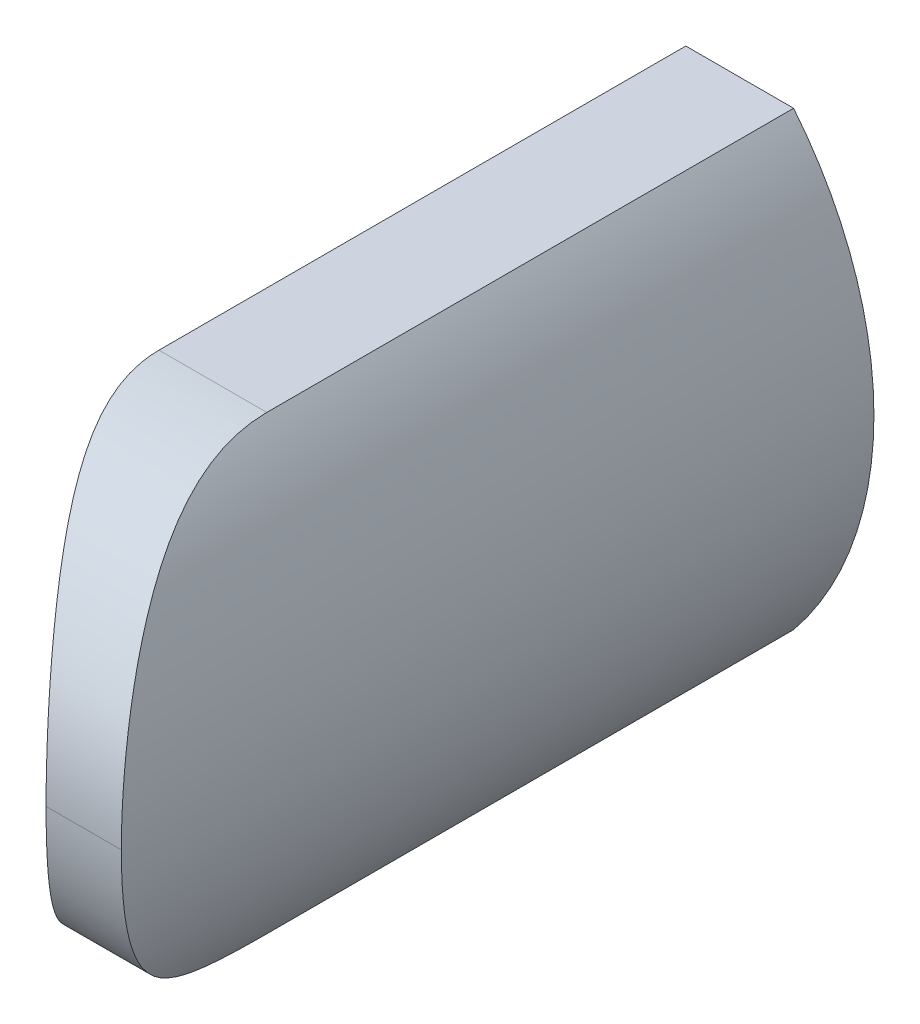
ISO-10303-21;
HEADER;
FILE_DESCRIPTION(('STEP AP214'),'2;1');
FILE_NAME('part.step','',(''),(''),'','','');
FILE_SCHEMA(('AUTOMOTIVE_DESIGN { 1 0 10303 214 1 1 1 1 }'));
ENDSEC;
DATA;
#1=APPLICATION_CONTEXT('core data for automotive mechanical design processes');
#2=APPLICATION_PROTOCOL_DEFINITION('international standard','automotive_design',2000,#1);
#3=PRODUCT_CONTEXT('',#1,'mechanical');
#4=PRODUCT('Part','Part','',(#3));
#5=PRODUCT_RELATED_PRODUCT_CATEGORY('part','',(#4));
#6=PRODUCT_DEFINITION_FORMATION('','',#4);
#7=PRODUCT_DEFINITION_CONTEXT('part definition',#1,'design');
#8=PRODUCT_DEFINITION('design','',#6,#7);
#9=PRODUCT_DEFINITION_SHAPE('','',#8);
#10=(LENGTH_UNIT() NAMED_UNIT(*) SI_UNIT(.MILLI.,.METRE.));
#11=(NAMED_UNIT(*) PLANE_ANGLE_UNIT() SI_UNIT($,.RADIAN.));
#12=(NAMED_UNIT(*) SI_UNIT($,.STERADIAN.) SOLID_ANGLE_UNIT());
#13=UNCERTAINTY_MEASURE_WITH_UNIT(LENGTH_MEASURE(1.E-05),#10,'distance_accuracy_value','');
#14=(GEOMETRIC_REPRESENTATION_CONTEXT(3) GLOBAL_UNCERTAINTY_ASSIGNED_CONTEXT((#13)) GLOBAL_UNIT_ASSIGNED_CONTEXT((#10,
#11,#12)) REPRESENTATION_CONTEXT('',''));
#15=CARTESIAN_POINT('',(0.,0.,0.));
#16=DIRECTION('',(0.,0.,1.));
#17=DIRECTION('',(1.,0.,0.));
#18=AXIS2_PLACEMENT_3D('',#15,#16,#17);
#19=CARTESIAN_POINT('',(0.,0.,100.));
#20=DIRECTION('',(0.,0.,-1.));
#21=DIRECTION('',(-1.,0.,0.));
#22=AXIS2_PLACEMENT_3D('',#19,#20,#21);
#23=CYLINDRICAL_SURFACE('',#22,37.5);
#24=CARTESIAN_POINT('',(22.5,-30.,70.));
#25=CARTESIAN_POINT('',(22.4999755658131,-30.0000088825759,70.2845192925939));
#26=CARTESIAN_POINT('',(22.5053961319682,-29.9959526730682,70.569029306874));
#27=CARTESIAN_POINT('',(22.5269459636406,-29.9797771303198,71.1373805460761));
#28=CARTESIAN_POINT('',(22.5430739326886,-29.9676587732563,71.4212218477919));
#29=CARTESIAN_POINT('',(22.5858217303771,-29.9354528016734,71.9871830245057));
#30=CARTESIAN_POINT('',(22.6124240440559,-29.9153784905536,72.2693049789032));
#31=CARTESIAN_POINT('',(22.6757694694017,-29.867391002862,72.8317215549527));
#32=CARTESIAN_POINT('',(22.7125128202786,-29.8394776413798,73.1120161333403));
#33=CARTESIAN_POINT('',(22.836214295342,-29.7450522223366,73.9419379410892));
#34=CARTESIAN_POINT('',(22.9372477378027,-29.6674082944875,74.488293183895));
#35=CARTESIAN_POINT('',(23.1729159717614,-29.4836931538108,75.5689031377295));
#36=CARTESIAN_POINT('',(23.3075673844913,-29.37760787723,76.103151720098));
#37=CARTESIAN_POINT('',(23.6587511995601,-29.0960572585306,77.3455500224995));
#38=CARTESIAN_POINT('',(23.8873580231885,-28.9093418710917,78.0477527341277));
#39=CARTESIAN_POINT('',(24.3852596002021,-28.4906092412228,79.4235269183799));
#40=CARTESIAN_POINT('',(24.6545685474847,-28.2585761870519,80.0970882976126));
#41=CARTESIAN_POINT('',(25.2249605266702,-27.7506425687184,81.4195898362314));
#42=CARTESIAN_POINT('',(25.5262509126886,-27.4744490108981,82.0683269099209));
#43=CARTESIAN_POINT('',(26.1497085231763,-26.8817393803553,83.3364912075327));
#44=CARTESIAN_POINT('',(26.4718757265193,-26.5652233484368,83.9559184611141));
#45=CARTESIAN_POINT('',(27.247486489959,-25.772701393832,85.3835368602757));
#46=CARTESIAN_POINT('',(27.7065148674869,-25.2802465216955,86.1796051370515));
#47=CARTESIAN_POINT('',(28.6330096703475,-24.2258942617638,87.7193922631023));
#48=CARTESIAN_POINT('',(29.1004790204633,-23.6639723935857,88.4630925119771));
#49=CARTESIAN_POINT('',(30.0297531085641,-22.4729504547567,89.8955356394915));
#50=CARTESIAN_POINT('',(30.4915668233143,-21.8439783021729,90.5843789361532));
#51=CARTESIAN_POINT('',(31.3986679639379,-20.5187274436987,91.9056335628192));
#52=CARTESIAN_POINT('',(31.8439608779519,-19.8224713713796,92.538063732862));
#53=CARTESIAN_POINT('',(32.6219663517772,-18.5073092423568,93.6232055259131));
#54=CARTESIAN_POINT('',(32.9595641522272,-17.9002229213543,94.0867647699818));
#55=CARTESIAN_POINT('',(33.6114585634017,-16.6439362752505,94.971374874733));
#56=CARTESIAN_POINT('',(33.9257560230783,-15.9947374861423,95.3924272843621));
#57=CARTESIAN_POINT('',(34.5251454181686,-14.6561041458242,96.1878587579433));
#58=CARTESIAN_POINT('',(34.8102612528835,-13.9667032578519,96.5622760707384));
#59=CARTESIAN_POINT('',(35.2118372251927,-12.9042624583826,97.0857147761584));
#60=CARTESIAN_POINT('',(35.3413415338409,-12.5454073954116,97.2538237624826));
#61=CARTESIAN_POINT('',(35.591025736255,-11.8184854269959,97.5768312267093));
#62=CARTESIAN_POINT('',(35.7112031641916,-11.4504161192868,97.7317262121773));
#63=CARTESIAN_POINT('',(36.0194760457166,-10.4534458225102,98.127868657706));
#64=CARTESIAN_POINT('',(36.1984702003831,-9.81666113328899,98.3565825753767));
#65=CARTESIAN_POINT('',(36.524990434802,-8.52177591365152,98.7722343802658));
#66=CARTESIAN_POINT('',(36.6725222547974,-7.86367929683643,98.9591798883479));
#67=CARTESIAN_POINT('',(36.8680297479422,-6.86393586274038,99.2062341995429));
#68=CARTESIAN_POINT('',(36.928869148048,-6.52881167904529,99.2829856467996));
#69=CARTESIAN_POINT('',(37.0417126561126,-5.8547672683848,99.4251651710082));
#70=CARTESIAN_POINT('',(37.0937183274969,-5.51584772447768,99.4905952516953));
#71=CARTESIAN_POINT('',(37.2360370778777,-4.49439557144583,99.6694750246301));
#72=CARTESIAN_POINT('',(37.3127330825291,-3.80675655641127,99.7656166128647));
#73=CARTESIAN_POINT('',(37.4134325060269,-2.59878792630196,99.8917378451276));
#74=CARTESIAN_POINT('',(37.4458627984957,-2.08020786856293,99.9323086950195));
#75=CARTESIAN_POINT('',(37.4891579436241,-1.04111645987851,99.9864474160654));
#76=CARTESIAN_POINT('',(37.500038099753,-0.520606742603307,100.000034449344));
#77=CARTESIAN_POINT('',(37.5,0.,100.));
#78=B_SPLINE_CURVE_WITH_KNOTS('',3,(#24,#25,#26,#27,#28,#29,#30,#31,#32,#33,#34,#35,#36,#37,#38,
#39,#40,#41,#42,#43,#44,#45,#46,#47,#48,#49,#50,#51,#52,#53,#54,#55,#56,#57,#58,#59,#60,#61,#62,
#63,#64,#65,#66,#67,#68,#69,#70,#71,#72,#73,#74,#75,#76,#77),.UNSPECIFIED.,.F.,.F.,(4,2,2,2,2,2,
2,2,2,2,2,2,2,2,2,2,2,2,2,2,2,2,2,2,2,2,4),(0.,0.853461655319061,1.70681999099969,
2.55875737945188,3.41071486538377,5.09153333129547,6.77318447062759,9.05470073284135,
11.3370144632647,13.6351522173132,15.9332876457926,19.0569624711207,22.1817412438871,
25.3006618037278,28.4185368210903,30.9216101329335,33.4245921999715,35.9255076784663,
37.1758640936124,38.4265499582637,40.52396337101,42.6209937866855,43.6681396143195,
44.7150999207258,46.8077255516257,48.3701793606076,49.9315232207576),.UNSPECIFIED.);
#79=CARTESIAN_POINT('',(22.5,-30.,70.));
#80=VERTEX_POINT('',#79);
#81=CARTESIAN_POINT('',(37.5,0.,100.));
#82=VERTEX_POINT('',#81);
#83=EDGE_CURVE('E59',#80,#82,#78,.T.);
#84=ORIENTED_EDGE('',*,*,#83,.T.);
#85=CARTESIAN_POINT('',(37.5,0.,100.));
#86=CARTESIAN_POINT('',(37.500010819369,0.362218520270511,100.000010261942));
#87=CARTESIAN_POINT('',(37.4947521408685,0.724430458356433,99.9934400902846));
#88=CARTESIAN_POINT('',(37.4737764392653,1.4480617852135,99.9672159890632));
#89=CARTESIAN_POINT('',(37.4580598723983,1.80948120786884,99.9475626302665));
#90=CARTESIAN_POINT('',(37.4162630161217,2.53053860988229,99.895266748233));
#91=CARTESIAN_POINT('',(37.3901896662152,2.89017761916106,99.8626329224636));
#92=CARTESIAN_POINT('',(37.3278456593031,3.60714468278668,99.784536355762));
#93=CARTESIAN_POINT('',(37.2915749498681,3.96447272524213,99.7390735488701));
#94=CARTESIAN_POINT('',(37.1683759923795,5.02661332053406,99.5844911820218));
#95=CARTESIAN_POINT('',(37.0667323223879,5.7271551775504,99.4567682894882));
#96=CARTESIAN_POINT('',(36.8262688650286,7.11123941215054,99.153603015151));
#97=CARTESIAN_POINT('',(36.6874445032417,7.79477968667706,98.9781547615535));
#98=CARTESIAN_POINT('',(36.3758832319662,9.13891877015147,98.582681401889));
#99=CARTESIAN_POINT('',(36.2032320862585,9.79957072537111,98.3627689852354));
#100=CARTESIAN_POINT('',(35.8270754734532,11.0962372955456,97.881032514544));
#101=CARTESIAN_POINT('',(35.6235709351086,11.7322526513915,97.6192097220849));
#102=CARTESIAN_POINT('',(35.1888437852252,12.9781079832019,97.0561785129403));
#103=CARTESIAN_POINT('',(34.9575759549589,13.5879029985659,96.7549057687392));
#104=CARTESIAN_POINT('',(34.4712072825657,14.7783455761204,96.116220016857));
#105=CARTESIAN_POINT('',(34.2161034952084,15.3589895226691,95.7788025422863));
#106=CARTESIAN_POINT('',(33.5935694168409,16.6862149590196,94.9475071697509));
#107=CARTESIAN_POINT('',(33.2178896335632,17.4204216945797,94.4399788298282));
#108=CARTESIAN_POINT('',(32.438637129187,18.8317574634167,93.369847635123));
#109=CARTESIAN_POINT('',(32.0350555270443,19.5088681696038,92.8072272207943));
#110=CARTESIAN_POINT('',(31.2078713705118,20.806540800048,91.6300072151435));
#111=CARTESIAN_POINT('',(30.784222716464,21.4269618694676,91.0152850950961));
#112=CARTESIAN_POINT('',(29.9269651172235,22.6088380197446,89.738221847327));
#113=CARTESIAN_POINT('',(29.4933573215228,23.170299864454,89.075886196588));
#114=CARTESIAN_POINT('',(28.619152522704,24.2421068745298,87.694535026837));
#115=CARTESIAN_POINT('',(28.1785523314988,24.7515146253686,86.9747947286401));
#116=CARTESIAN_POINT('',(27.3086453898674,25.7080819719638,85.4879394653739));
#117=CARTESIAN_POINT('',(26.8793422866718,26.1552216598723,84.7208094618908));
#118=CARTESIAN_POINT('',(26.2554074205718,26.7766641898664,83.5354504700038));
#119=CARTESIAN_POINT('',(26.0509895984756,26.9753999944134,83.1350342523555));
#120=CARTESIAN_POINT('',(25.6507564463487,27.356261639706,82.3221954493724));
#121=CARTESIAN_POINT('',(25.4549415351427,27.5383866722349,81.9097722811119));
#122=CARTESIAN_POINT('',(24.8841540097768,28.058742208421,80.6548815409657));
#123=CARTESIAN_POINT('',(24.5253484696591,28.3714333539267,79.7938822576464));
#124=CARTESIAN_POINT('',(24.0073717870351,28.8090255588542,78.3868520378598));
#125=CARTESIAN_POINT('',(23.8266160323057,28.9583932267527,77.8562123247088));
#126=CARTESIAN_POINT('',(23.4934543010885,29.2293283616286,76.7789869002862));
#127=CARTESIAN_POINT('',(23.3410481203536,29.350896028895,76.2324013039308));
#128=CARTESIAN_POINT('',(23.0705715818094,29.5639709924464,75.127107843029));
#129=CARTESIAN_POINT('',(22.952381001627,29.6555836912868,74.5684500216583));
#130=CARTESIAN_POINT('',(22.7547334345133,29.8075115005525,73.4403145910329));
#131=CARTESIAN_POINT('',(22.6752526247146,29.8678458618509,72.8708438610864));
#132=CARTESIAN_POINT('',(22.5783623846566,29.9411075608744,71.9172805673983));
#133=CARTESIAN_POINT('',(22.5490763715645,29.9631471319107,71.5350488302949));
#134=CARTESIAN_POINT('',(22.5098479600887,29.9926143679571,70.768570938288));
#135=CARTESIAN_POINT('',(22.4999291265209,30.0000242325447,70.3843228990598));
#136=CARTESIAN_POINT('',(22.5,30.,70.));
#137=B_SPLINE_CURVE_WITH_KNOTS('',3,(#85,#86,#87,#88,#89,#90,#91,#92,#93,#94,#95,#96,#97,#98,
#99,#100,#101,#102,#103,#104,#105,#106,#107,#108,#109,#110,#111,#112,#113,#114,#115,#116,#117,
#118,#119,#120,#121,#122,#123,#124,#125,#126,#127,#128,#129,#130,#131,#132,#133,#134,#135,#136),
.UNSPECIFIED.,.F.,.F.,(4,2,2,2,2,2,2,2,2,2,2,2,2,2,2,2,2,2,2,2,2,2,2,2,2,4),(0.,
1.08654608708858,2.17304477564666,3.25881668671824,4.34459418034611,6.49941862809946,
8.65450831034947,10.8042031219805,12.953833236046,15.1070132558852,17.2604596807505,
20.1615182191199,23.0635044430002,25.9725154794955,28.8811924263651,31.8353869431814,
34.7905237936848,36.2647022580913,37.7389524121646,40.6840446346466,42.4232002732122,
44.1623433813931,45.8952994091938,47.6271875847921,48.7784198558804,49.9310520062332),.UNSPECIFIED.);
#138=CARTESIAN_POINT('',(22.5,30.,70.));
#139=VERTEX_POINT('',#138);
#140=EDGE_CURVE('E52',#82,#139,#137,.T.);
#141=ORIENTED_EDGE('',*,*,#140,.T.);
#142=DIRECTION('',(0.,0.,-1.));
#143=VECTOR('',#142,1.);
#144=CARTESIAN_POINT('',(22.5,30.,100.));
#145=LINE('',#144,#143);
#146=CARTESIAN_POINT('',(22.5,30.,0.));
#147=VERTEX_POINT('',#146);
#148=EDGE_CURVE('E109',#139,#147,#145,.T.);
#149=ORIENTED_EDGE('',*,*,#148,.T.);
#150=CARTESIAN_POINT('',(0.,0.,0.));
#151=DIRECTION('',(0.,0.,1.));
#152=DIRECTION('',(1.,0.,0.));
#153=AXIS2_PLACEMENT_3D('',#150,#151,#152);
#154=CIRCLE('',#153,37.5);
#155=CARTESIAN_POINT('',(22.5,-30.,0.));
#156=VERTEX_POINT('',#155);
#157=EDGE_CURVE('E102',#156,#147,#154,.T.);
#158=ORIENTED_EDGE('',*,*,#157,.F.);
#159=DIRECTION('',(0.,0.,-1.));
#160=VECTOR('',#159,1.);
#161=CARTESIAN_POINT('',(22.5,-30.,100.));
#162=LINE('',#161,#160);
#163=EDGE_CURVE('E88',#80,#156,#162,.T.);
#164=ORIENTED_EDGE('',*,*,#163,.F.);
#165=EDGE_LOOP('',(#84,#141,#149,#158,#164));
#166=FACE_BOUND('',#165,.T.);
#167=ADVANCED_FACE('F41',(#166),#23,.F.);
#168=CARTESIAN_POINT('',(0.,-30.,100.));
#169=DIRECTION('',(0.,1.,0.));
#170=DIRECTION('',(0.,0.,1.));
#171=AXIS2_PLACEMENT_3D('',#168,#169,#170);
#172=PLANE('',#171);
#173=DIRECTION('',(0.,0.,-1.));
#174=VECTOR('',#173,1.);
#175=CARTESIAN_POINT('',(36.8272996566406,-30.,100.));
#176=LINE('',#175,#174);
#177=CARTESIAN_POINT('',(36.8272996566406,-30.,70.));
#178=VERTEX_POINT('',#177);
#179=CARTESIAN_POINT('',(36.8272996566406,-30.,0.));
#180=VERTEX_POINT('',#179);
#181=EDGE_CURVE('E96',#178,#180,#176,.T.);
#182=ORIENTED_EDGE('',*,*,#181,.F.);
#183=DIRECTION('',(1.,0.,0.));
#184=VECTOR('',#183,1.);
#185=CARTESIAN_POINT('',(22.5,-30.,70.));
#186=LINE('',#185,#184);
#187=EDGE_CURVE('E11',#178,#80,#186,.F.);
#188=ORIENTED_EDGE('',*,*,#187,.T.);
#189=ORIENTED_EDGE('',*,*,#163,.T.);
#190=DIRECTION('',(1.,0.,0.));
#191=VECTOR('',#190,1.);
#192=CARTESIAN_POINT('',(0.,-30.,0.));
#193=LINE('',#192,#191);
#194=EDGE_CURVE('E91',#156,#180,#193,.T.);
#195=ORIENTED_EDGE('',*,*,#194,.T.);
#196=EDGE_LOOP('',(#182,#188,#189,#195));
#197=FACE_BOUND('',#196,.T.);
#198=ADVANCED_FACE('F90',(#197),#172,.F.);
#199=CARTESIAN_POINT('',(0.,0.,100.));
#200=DIRECTION('',(0.,0.,-1.));
#201=DIRECTION('',(-1.,0.,0.));
#202=AXIS2_PLACEMENT_3D('',#199,#200,#201);
#203=CYLINDRICAL_SURFACE('',#202,47.5);
#204=DIRECTION('',(0.,0.,-1.));
#205=VECTOR('',#204,1.);
#206=CARTESIAN_POINT('',(36.8272996566406,30.,100.));
#207=LINE('',#206,#205);
#208=CARTESIAN_POINT('',(36.8272996566406,30.,70.));
#209=VERTEX_POINT('',#208);
#210=CARTESIAN_POINT('',(36.8272996566406,30.,0.));
#211=VERTEX_POINT('',#210);
#212=EDGE_CURVE('E122',#209,#211,#207,.T.);
#213=ORIENTED_EDGE('',*,*,#212,.F.);
#214=CARTESIAN_POINT('',(36.8272996566406,30.,70.));
#215=CARTESIAN_POINT('',(36.8272760252913,30.0000119524912,70.3744705023444));
#216=CARTESIAN_POINT('',(36.8330106676189,29.9929888709776,70.7489312554226));
#217=CARTESIAN_POINT('',(36.8558215756884,29.9649630843384,71.4969532821226));
#218=CARTESIAN_POINT('',(36.8728969050696,29.9439615333656,71.8705146274498));
#219=CARTESIAN_POINT('',(36.9181891933289,29.8881002108401,72.6155067212047));
#220=CARTESIAN_POINT('',(36.9463937775577,29.8532558308755,72.9869393727466));
#221=CARTESIAN_POINT('',(37.0135984428523,29.7698902683722,73.7272582136839));
#222=CARTESIAN_POINT('',(37.0525986710425,29.7213688994415,74.096144368305));
#223=CARTESIAN_POINT('',(37.1843779936369,29.5565903665442,75.1912699947107));
#224=CARTESIAN_POINT('',(37.2923682860848,29.4205958514294,75.9128528438496));
#225=CARTESIAN_POINT('',(37.544697926757,29.0978928554503,77.3380520192978));
#226=CARTESIAN_POINT('',(37.6890459603952,28.911172255914,78.041664008293));
#227=CARTESIAN_POINT('',(38.0080391626234,28.4904941476715,79.4239795298412));
#228=CARTESIAN_POINT('',(38.1825493139831,28.2567464165816,80.1027783935865));
#229=CARTESIAN_POINT('',(38.5566879428236,27.7440523754246,81.4358040726492));
#230=CARTESIAN_POINT('',(38.7563154494197,27.4651078122731,82.0900318364678));
#231=CARTESIAN_POINT('',(39.1756393533657,26.8636177493127,83.3734632470184));
#232=CARTESIAN_POINT('',(39.3953827199549,26.5409693162412,84.0026031356644));
#233=CARTESIAN_POINT('',(39.8491978038401,25.854607382679,85.2327101414161));
#234=CARTESIAN_POINT('',(40.0832712714147,25.490888861288,85.8336738011845));
#235=CARTESIAN_POINT('',(40.5932217048838,24.6719184885173,87.085953432509));
#236=CARTESIAN_POINT('',(40.8704509817419,24.210946647933,87.7329835872712));
#237=CARTESIAN_POINT('',(41.4300288598571,23.240407577867,88.9871605048803));
#238=CARTESIAN_POINT('',(41.7123777852481,22.7308372627704,89.5943047311506));
#239=CARTESIAN_POINT('',(42.2759248274,21.6647145897254,90.7670006959737));
#240=CARTESIAN_POINT('',(42.5571223733168,21.1081413320642,91.3325337208677));
#241=CARTESIAN_POINT('',(43.1122000894132,19.9499539572999,92.4194126497035));
#242=CARTESIAN_POINT('',(43.3860798695,19.3483374455212,92.9407562012141));
#243=CARTESIAN_POINT('',(43.9542879658749,18.0236752833935,93.9990206156484));
#244=CARTESIAN_POINT('',(44.2468725340384,17.2948636626021,94.5296938187127));
#245=CARTESIAN_POINT('',(44.8075067195028,15.7856069470746,95.5270985698015));
#246=CARTESIAN_POINT('',(45.0755532313304,15.005155338388,95.9938220282138));
#247=CARTESIAN_POINT('',(45.5788899719235,13.3985755960801,96.8571767618759));
#248=CARTESIAN_POINT('',(45.8142492127043,12.5725490032329,97.2539562009948));
#249=CARTESIAN_POINT('',(46.2456716351011,10.8789109482505,97.9731116775627));
#250=CARTESIAN_POINT('',(46.4417450717189,10.0113104118706,98.2955071352329));
#251=CARTESIAN_POINT('',(46.7570643151565,8.40085724737134,98.8098319845941));
#252=CARTESIAN_POINT('',(46.88378422608,7.66359818025272,99.014794846428));
#253=CARTESIAN_POINT('',(47.1035030484575,6.17077318763714,99.3685090096893));
#254=CARTESIAN_POINT('',(47.196510433448,5.41521191334817,99.5172744365609));
#255=CARTESIAN_POINT('',(47.3092418737935,4.27017062585201,99.6970783051377));
#256=CARTESIAN_POINT('',(47.3424194328644,3.8852711188385,99.7498890739356));
#257=CARTESIAN_POINT('',(47.3994623890101,3.11300215757887,99.840581398697));
#258=CARTESIAN_POINT('',(47.4233278545305,2.72563272150846,99.8784630643923));
#259=CARTESIAN_POINT('',(47.4615920530116,1.94897679967635,99.9391599733618));
#260=CARTESIAN_POINT('',(47.4759840315103,1.55968914505528,99.9619644668769));
#261=CARTESIAN_POINT('',(47.4951936572676,0.780269920532357,99.9923897668571));
#262=CARTESIAN_POINT('',(47.5000109180617,0.39013831720241,100.000009960438));
#263=CARTESIAN_POINT('',(47.5,0.,100.));
#264=B_SPLINE_CURVE_WITH_KNOTS('',3,(#214,#215,#216,#217,#218,#219,#220,#221,#222,#223,#224,
#225,#226,#227,#228,#229,#230,#231,#232,#233,#234,#235,#236,#237,#238,#239,#240,#241,#242,#243,
#244,#245,#246,#247,#248,#249,#250,#251,#252,#253,#254,#255,#256,#257,#258,#259,#260,#261,#262,
#263),.UNSPECIFIED.,.F.,.F.,(4,2,2,2,2,2,2,2,2,2,2,2,2,2,2,2,2,2,2,2,2,2,2,2,4),(0.,
1.1232849313584,2.24647712854716,3.368423948563,4.49038605936296,6.71366191022586,
8.93746937871336,11.1515685224159,13.3655821087443,15.5849039703364,17.804497442799,
20.3263145705989,22.8482919203757,25.3713966241948,27.8946355615089,30.7343509590955,
33.5744252483308,36.4084090988776,39.2416522115934,41.5658505222795,43.8894642473395,
45.058891451156,46.2283100592976,47.3985615458112,48.5688602662622),.UNSPECIFIED.);
#265=CARTESIAN_POINT('',(47.5,0.,100.));
#266=VERTEX_POINT('',#265);
#267=EDGE_CURVE('E138',#209,#266,#264,.T.);
#268=ORIENTED_EDGE('',*,*,#267,.T.);
#269=CARTESIAN_POINT('',(47.5,0.,100.));
#270=CARTESIAN_POINT('',(47.5000100796486,-0.38219839519262,100.000009206673));
#271=CARTESIAN_POINT('',(47.4953872990936,-0.764390672466454,99.9926963794119));
#272=CARTESIAN_POINT('',(47.4769508919626,-1.52798332428207,99.9634961403687));
#273=CARTESIAN_POINT('',(47.4631375808318,-1.90938372555261,99.9416092288106));
#274=CARTESIAN_POINT('',(47.4264046251384,-2.67043941052976,99.883345598364));
#275=CARTESIAN_POINT('',(47.4034897666099,-3.05009550550628,99.8469764948875));
#276=CARTESIAN_POINT('',(47.3487086889759,-3.80708232753499,99.7598948553734));
#277=CARTESIAN_POINT('',(47.3168424353601,-4.18441304561646,99.7091822640376));
#278=CARTESIAN_POINT('',(47.2085109046628,-5.30748661152439,99.5364470295484));
#279=CARTESIAN_POINT('',(47.1190871447788,-6.0489058993691,99.3934717458784));
#280=CARTESIAN_POINT('',(46.9077013379291,-7.51439191973755,99.0534011588866));
#281=CARTESIAN_POINT('',(46.7857363865417,-8.23845709705281,98.8563010246755));
#282=CARTESIAN_POINT('',(46.5123040359035,-9.66337675540127,98.4108304451639));
#283=CARTESIAN_POINT('',(46.3608913646515,-10.3642715136903,98.1625550576077));
#284=CARTESIAN_POINT('',(46.0316735193011,-11.7403423522779,97.617244564075));
#285=CARTESIAN_POINT('',(45.8538685308212,-12.4155186134139,97.3202098010239));
#286=CARTESIAN_POINT('',(45.4752549886255,-13.7377067658886,96.6798717072235));
#287=CARTESIAN_POINT('',(45.2744230478307,-14.3846890856156,96.3365212728826));
#288=CARTESIAN_POINT('',(44.8537211236603,-15.6472543781645,95.6065472906619));
#289=CARTESIAN_POINT('',(44.6338502719634,-16.2628359168315,95.2199217688684));
#290=CARTESIAN_POINT('',(44.1608732325568,-17.5084490666388,94.3734614327437));
#291=CARTESIAN_POINT('',(43.9065151485633,-18.1357076035737,93.9102457229754));
#292=CARTESIAN_POINT('',(43.3854020864628,-19.3492385140492,92.9392880481108));
#293=CARTESIAN_POINT('',(43.1186465745894,-19.9355091201435,92.4315441650347));
#294=CARTESIAN_POINT('',(42.5776777423672,-21.066198153932,91.3732501159994));
#295=CARTESIAN_POINT('',(42.3034537230368,-21.6105517468428,90.8226361852988));
#296=CARTESIAN_POINT('',(41.7535379705963,-22.654808834906,89.6814111751558));
#297=CARTESIAN_POINT('',(41.4778461430661,-23.1547094329884,89.0907974932803));
#298=CARTESIAN_POINT('',(40.8925783824899,-24.1751866018359,87.7859256063628));
#299=CARTESIAN_POINT('',(40.5836670374925,-24.6888465303872,87.0659378277592));
#300=CARTESIAN_POINT('',(39.981054179145,-25.6532401898055,85.5787294958039));
#301=CARTESIAN_POINT('',(39.6873550837274,-26.1039639363824,84.8115014759456));
#302=CARTESIAN_POINT('',(39.1265128864586,-26.9372862222385,83.2353484671004));
#303=CARTESIAN_POINT('',(38.8592796378721,-27.3201197964035,82.4265803516139));
#304=CARTESIAN_POINT('',(38.3612413769515,-28.0151414229035,80.7684377800293));
#305=CARTESIAN_POINT('',(38.1304267908816,-28.3273480510372,79.9190740724501));
#306=CARTESIAN_POINT('',(37.7527025799806,-28.8281790354213,78.3366342930944));
#307=CARTESIAN_POINT('',(37.5981789989789,-29.0288657181219,77.6091788739577));
#308=CARTESIAN_POINT('',(37.3276954117312,-29.375871620129,76.1344253485099));
#309=CARTESIAN_POINT('',(37.2117196933462,-29.5222129934859,75.3871354611963));
#310=CARTESIAN_POINT('',(37.0700254522796,-29.6996435412774,74.2520585066864));
#311=CARTESIAN_POINT('',(37.0280484228277,-29.7519230217643,73.8694509639484));
#312=CARTESIAN_POINT('',(36.955684031293,-29.8417623163419,73.101393161816));
#313=CARTESIAN_POINT('',(36.9252964624173,-29.8793223930741,72.7159429532689));
#314=CARTESIAN_POINT('',(36.8764778967419,-29.9395550759371,71.9425867011182));
#315=CARTESIAN_POINT('',(36.8580636444373,-29.9622068335553,71.5546779810395));
#316=CARTESIAN_POINT('',(36.8334602043772,-29.9924369641901,70.777850074409));
#317=CARTESIAN_POINT('',(36.8272722107489,-30.00001386486,70.3889307928708));
#318=CARTESIAN_POINT('',(36.8272996566406,-30.,70.));
#319=B_SPLINE_CURVE_WITH_KNOTS('',3,(#269,#270,#271,#272,#273,#274,#275,#276,#277,#278,#279,
#280,#281,#282,#283,#284,#285,#286,#287,#288,#289,#290,#291,#292,#293,#294,#295,#296,#297,#298,
#299,#300,#301,#302,#303,#304,#305,#306,#307,#308,#309,#310,#311,#312,#313,#314,#315,#316,#317,
#318),.UNSPECIFIED.,.F.,.F.,(4,2,2,2,2,2,2,2,2,2,2,2,2,2,2,2,2,2,2,2,2,2,2,2,4),(0.,
1.1464862571743,2.29293316570696,3.43877801340214,4.58462727871686,6.86253195589333,
9.14064001254702,11.4145540252115,13.6884520460827,15.9646803334315,18.2410124890964,
20.6991627114596,23.1574188667647,25.6194039628786,28.0815493929391,30.8886680407099,
33.6962315092642,36.493876958421,39.2907857329841,41.5988662471088,43.9060048288078,
45.0709356369576,46.2358456580567,47.4023813034794,48.5690308777122),.UNSPECIFIED.);
#320=EDGE_CURVE('E130',#266,#178,#319,.T.);
#321=ORIENTED_EDGE('',*,*,#320,.T.);
#322=ORIENTED_EDGE('',*,*,#181,.T.);
#323=CARTESIAN_POINT('',(0.,0.,0.));
#324=DIRECTION('',(0.,0.,1.));
#325=DIRECTION('',(1.,0.,0.));
#326=AXIS2_PLACEMENT_3D('',#323,#324,#325);
#327=CIRCLE('',#326,47.5);
#328=EDGE_CURVE('E105',#180,#211,#327,.T.);
#329=ORIENTED_EDGE('',*,*,#328,.T.);
#330=EDGE_LOOP('',(#213,#268,#321,#322,#329));
#331=FACE_BOUND('',#330,.T.);
#332=ADVANCED_FACE('F144',(#331),#203,.T.);
#333=CARTESIAN_POINT('',(0.,30.,100.));
#334=DIRECTION('',(0.,1.,0.));
#335=DIRECTION('',(0.,0.,1.));
#336=AXIS2_PLACEMENT_3D('',#333,#334,#335);
#337=PLANE('',#336);
#338=ORIENTED_EDGE('',*,*,#148,.F.);
#339=DIRECTION('',(1.,0.,0.));
#340=VECTOR('',#339,1.);
#341=CARTESIAN_POINT('',(0.,30.,70.));
#342=LINE('',#341,#340);
#343=EDGE_CURVE('E95',#139,#209,#342,.T.);
#344=ORIENTED_EDGE('',*,*,#343,.T.);
#345=ORIENTED_EDGE('',*,*,#212,.T.);
#346=DIRECTION('',(1.,0.,0.));
#347=VECTOR('',#346,1.);
#348=CARTESIAN_POINT('',(0.,30.,0.));
#349=LINE('',#348,#347);
#350=EDGE_CURVE('E117',#147,#211,#349,.T.);
#351=ORIENTED_EDGE('',*,*,#350,.F.);
#352=EDGE_LOOP('',(#338,#344,#345,#351));
#353=FACE_BOUND('',#352,.T.);
#354=ADVANCED_FACE('F149',(#353),#337,.T.);
#355=CARTESIAN_POINT('',(0.,0.,0.));
#356=DIRECTION('',(0.,0.,1.));
#357=DIRECTION('',(1.,0.,0.));
#358=AXIS2_PLACEMENT_3D('',#355,#356,#357);
#359=PLANE('',#358);
#360=ORIENTED_EDGE('',*,*,#157,.T.);
#361=ORIENTED_EDGE('',*,*,#350,.T.);
#362=ORIENTED_EDGE('',*,*,#328,.F.);
#363=ORIENTED_EDGE('',*,*,#194,.F.);
#364=EDGE_LOOP('',(#360,#361,#362,#363));
#365=FACE_BOUND('',#364,.T.);
#366=ADVANCED_FACE('F100',(#365),#359,.F.);
#367=CARTESIAN_POINT('',(0.,0.,70.));
#368=DIRECTION('',(-1.,0.,0.));
#369=DIRECTION('',(0.,0.,1.));
#370=AXIS2_PLACEMENT_3D('',#367,#368,#369);
#371=CYLINDRICAL_SURFACE('',#370,30.);
#372=DIRECTION('',(1.,0.,0.));
#373=VECTOR('',#372,1.);
#374=CARTESIAN_POINT('',(36.8272996566406,0.,100.));
#375=LINE('',#374,#373);
#376=EDGE_CURVE('E46',#82,#266,#375,.T.);
#377=ORIENTED_EDGE('',*,*,#376,.F.);
#378=ORIENTED_EDGE('',*,*,#83,.F.);
#379=ORIENTED_EDGE('',*,*,#187,.F.);
#380=ORIENTED_EDGE('',*,*,#320,.F.);
#381=EDGE_LOOP('',(#377,#378,#379,#380));
#382=FACE_BOUND('',#381,.T.);
#383=ADVANCED_FACE('F43',(#382),#371,.T.);
#384=CARTESIAN_POINT('',(0.,0.,70.));
#385=DIRECTION('',(1.,0.,0.));
#386=DIRECTION('',(0.,0.,-1.));
#387=AXIS2_PLACEMENT_3D('',#384,#385,#386);
#388=CYLINDRICAL_SURFACE('',#387,30.);
#389=ORIENTED_EDGE('',*,*,#140,.F.);
#390=ORIENTED_EDGE('',*,*,#376,.T.);
#391=ORIENTED_EDGE('',*,*,#267,.F.);
#392=ORIENTED_EDGE('',*,*,#343,.F.);
#393=EDGE_LOOP('',(#389,#390,#391,#392));
#394=FACE_BOUND('',#393,.T.);
#395=ADVANCED_FACE('F157',(#394),#388,.T.);
#396=CLOSED_SHELL('',(#167,#198,#332,#354,#366,#383,#395));
#397=MANIFOLD_SOLID_BREP('B2',#396);
#398=ADVANCED_BREP_SHAPE_REPRESENTATION('',(#18,#397),#14);
#399=SHAPE_DEFINITION_REPRESENTATION(#9,#398);
ENDSEC;
END-ISO-10303-21;
